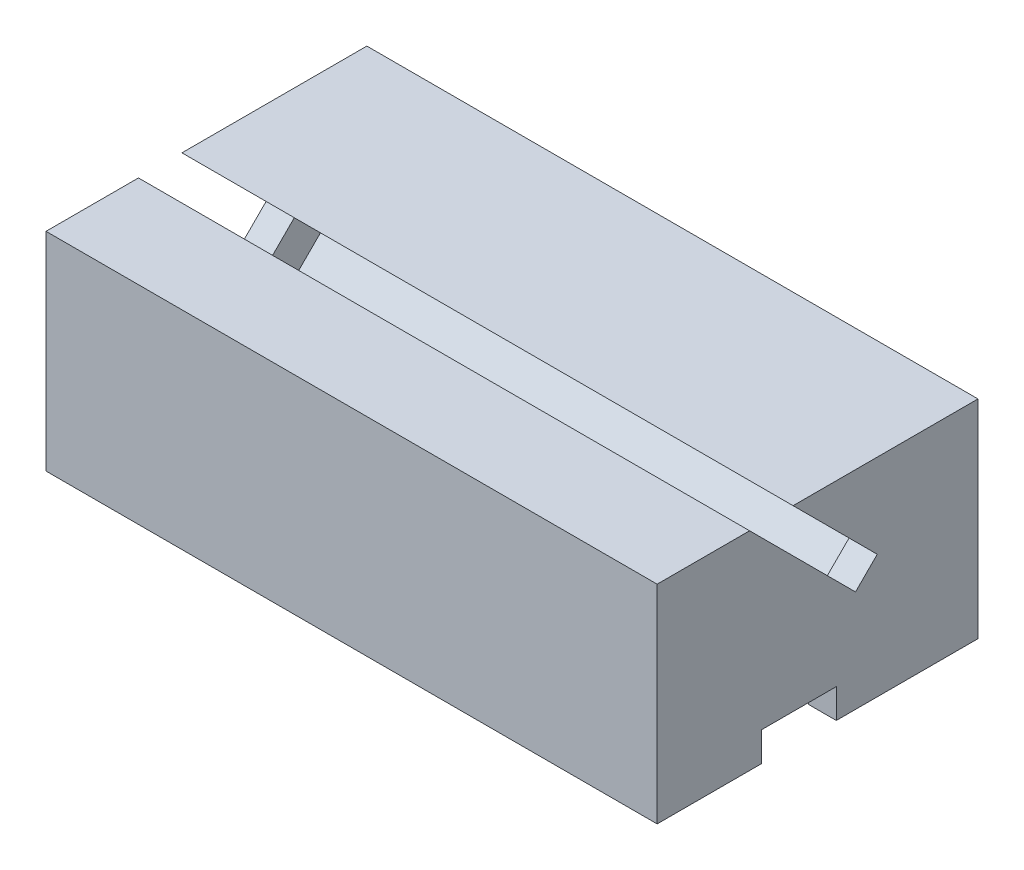
ISO-10303-21;
HEADER;
FILE_DESCRIPTION(('STEP AP214'),'2;1');
FILE_NAME('part.step','',(''),(''),'','','');
FILE_SCHEMA(('AUTOMOTIVE_DESIGN { 1 0 10303 214 1 1 1 1 }'));
ENDSEC;
DATA;
#1=APPLICATION_CONTEXT('core data for automotive mechanical design processes');
#2=APPLICATION_PROTOCOL_DEFINITION('international standard','automotive_design',2000,#1);
#3=PRODUCT_CONTEXT('',#1,'mechanical');
#4=PRODUCT('Part','Part','',(#3));
#5=PRODUCT_RELATED_PRODUCT_CATEGORY('part','',(#4));
#6=PRODUCT_DEFINITION_FORMATION('','',#4);
#7=PRODUCT_DEFINITION_CONTEXT('part definition',#1,'design');
#8=PRODUCT_DEFINITION('design','',#6,#7);
#9=PRODUCT_DEFINITION_SHAPE('','',#8);
#10=(LENGTH_UNIT() NAMED_UNIT(*) SI_UNIT(.MILLI.,.METRE.));
#11=(NAMED_UNIT(*) PLANE_ANGLE_UNIT() SI_UNIT($,.RADIAN.));
#12=(NAMED_UNIT(*) SI_UNIT($,.STERADIAN.) SOLID_ANGLE_UNIT());
#13=UNCERTAINTY_MEASURE_WITH_UNIT(LENGTH_MEASURE(1.E-05),#10,'distance_accuracy_value','');
#14=(GEOMETRIC_REPRESENTATION_CONTEXT(3) GLOBAL_UNCERTAINTY_ASSIGNED_CONTEXT((#13)) GLOBAL_UNIT_ASSIGNED_CONTEXT((#10,
#11,#12)) REPRESENTATION_CONTEXT('',''));
#15=CARTESIAN_POINT('',(0.,0.,0.));
#16=DIRECTION('',(0.,0.,1.));
#17=DIRECTION('',(1.,0.,0.));
#18=AXIS2_PLACEMENT_3D('',#15,#16,#17);
#19=CARTESIAN_POINT('',(66.1,0.,0.));
#20=DIRECTION('',(0.,-1.,0.));
#21=DIRECTION('',(0.,0.,-1.));
#22=AXIS2_PLACEMENT_3D('',#19,#20,#21);
#23=PLANE('',#22);
#24=CARTESIAN_POINT('',(12.05,0.,-14.1761300474453));
#25=DIRECTION('',(0.,-1.,0.));
#26=DIRECTION('',(0.,0.,-1.));
#27=AXIS2_PLACEMENT_3D('',#24,#25,#26);
#28=CIRCLE('',#27,2.99999999999999);
#29=CARTESIAN_POINT('',(12.05,0.,-17.1761300474453));
#30=VERTEX_POINT('',#29);
#31=EDGE_CURVE('E477',#30,#30,#28,.F.);
#32=ORIENTED_EDGE('',*,*,#31,.T.);
#33=EDGE_LOOP('',(#32));
#34=FACE_BOUND('',#33,.T.);
#35=CARTESIAN_POINT('',(54.05,0.,-14.1761300474453));
#36=DIRECTION('',(0.,-1.,0.));
#37=DIRECTION('',(0.,0.,-1.));
#38=AXIS2_PLACEMENT_3D('',#35,#36,#37);
#39=CIRCLE('',#38,3.);
#40=CARTESIAN_POINT('',(54.05,0.,-17.1761300474453));
#41=VERTEX_POINT('',#40);
#42=EDGE_CURVE('E473',#41,#41,#39,.F.);
#43=ORIENTED_EDGE('',*,*,#42,.T.);
#44=EDGE_LOOP('',(#43));
#45=FACE_BOUND('',#44,.T.);
#46=DIRECTION('',(0.,0.,-1.));
#47=VECTOR('',#46,1.);
#48=CARTESIAN_POINT('',(2.99999999999999,0.,0.));
#49=LINE('',#48,#47);
#50=CARTESIAN_POINT('',(3.,0.,-19.3761300474453));
#51=VERTEX_POINT('',#50);
#52=CARTESIAN_POINT('',(3.,0.,-24.3511300474453));
#53=VERTEX_POINT('',#52);
#54=EDGE_CURVE('E271',#51,#53,#49,.T.);
#55=ORIENTED_EDGE('',*,*,#54,.T.);
#56=DIRECTION('',(1.,0.,0.));
#57=VECTOR('',#56,1.);
#58=CARTESIAN_POINT('',(63.1,0.,-24.3511300474453));
#59=LINE('',#58,#57);
#60=CARTESIAN_POINT('',(63.1,0.,-24.3511300474453));
#61=VERTEX_POINT('',#60);
#62=EDGE_CURVE('E481',#53,#61,#59,.T.);
#63=ORIENTED_EDGE('',*,*,#62,.T.);
#64=DIRECTION('',(0.,0.,1.));
#65=VECTOR('',#64,1.);
#66=CARTESIAN_POINT('',(63.1,0.,0.));
#67=LINE('',#66,#65);
#68=CARTESIAN_POINT('',(63.1,0.,-19.3761300474453));
#69=VERTEX_POINT('',#68);
#70=EDGE_CURVE('E267',#61,#69,#67,.T.);
#71=ORIENTED_EDGE('',*,*,#70,.T.);
#72=DIRECTION('',(1.,0.,0.));
#73=VECTOR('',#72,1.);
#74=CARTESIAN_POINT('',(0.,0.,-19.3761300474453));
#75=LINE('',#74,#73);
#76=CARTESIAN_POINT('',(66.1,0.,-19.3761300474453));
#77=VERTEX_POINT('',#76);
#78=EDGE_CURVE('E222',#69,#77,#75,.T.);
#79=ORIENTED_EDGE('',*,*,#78,.T.);
#80=DIRECTION('',(0.,0.,1.));
#81=VECTOR('',#80,1.);
#82=CARTESIAN_POINT('',(66.1,0.,0.));
#83=LINE('',#82,#81);
#84=CARTESIAN_POINT('',(66.1,0.,-11.2761300474453));
#85=VERTEX_POINT('',#84);
#86=EDGE_CURVE('E425',#77,#85,#83,.T.);
#87=ORIENTED_EDGE('',*,*,#86,.T.);
#88=DIRECTION('',(1.,0.,0.));
#89=VECTOR('',#88,1.);
#90=CARTESIAN_POINT('',(0.,0.,-11.2761300474453));
#91=LINE('',#90,#89);
#92=CARTESIAN_POINT('',(63.1,0.,-11.2761300474453));
#93=VERTEX_POINT('',#92);
#94=EDGE_CURVE('E317',#93,#85,#91,.T.);
#95=ORIENTED_EDGE('',*,*,#94,.F.);
#96=DIRECTION('',(0.,0.,-1.));
#97=VECTOR('',#96,1.);
#98=CARTESIAN_POINT('',(63.1,0.,0.));
#99=LINE('',#98,#97);
#100=CARTESIAN_POINT('',(63.1,0.,-7.17613004744528));
#101=VERTEX_POINT('',#100);
#102=EDGE_CURVE('E227',#101,#93,#99,.T.);
#103=ORIENTED_EDGE('',*,*,#102,.F.);
#104=DIRECTION('',(1.,0.,0.));
#105=VECTOR('',#104,1.);
#106=CARTESIAN_POINT('',(0.,0.,-7.17613004744528));
#107=LINE('',#106,#105);
#108=CARTESIAN_POINT('',(3.,0.,-7.17613004744528));
#109=VERTEX_POINT('',#108);
#110=EDGE_CURVE('E290',#109,#101,#107,.T.);
#111=ORIENTED_EDGE('',*,*,#110,.F.);
#112=DIRECTION('',(0.,0.,1.));
#113=VECTOR('',#112,1.);
#114=CARTESIAN_POINT('',(3.,0.,0.));
#115=LINE('',#114,#113);
#116=CARTESIAN_POINT('',(3.,0.,-11.2761300474453));
#117=VERTEX_POINT('',#116);
#118=EDGE_CURVE('E325',#117,#109,#115,.T.);
#119=ORIENTED_EDGE('',*,*,#118,.F.);
#120=DIRECTION('',(1.,0.,0.));
#121=VECTOR('',#120,1.);
#122=CARTESIAN_POINT('',(0.,0.,-11.2761300474453));
#123=LINE('',#122,#121);
#124=CARTESIAN_POINT('',(0.,0.,-11.2761300474453));
#125=VERTEX_POINT('',#124);
#126=EDGE_CURVE('E321',#125,#117,#123,.T.);
#127=ORIENTED_EDGE('',*,*,#126,.F.);
#128=DIRECTION('',(0.,0.,1.));
#129=VECTOR('',#128,1.);
#130=CARTESIAN_POINT('',(0.,0.,0.));
#131=LINE('',#130,#129);
#132=CARTESIAN_POINT('',(0.,0.,-19.3761300474453));
#133=VERTEX_POINT('',#132);
#134=EDGE_CURVE('E450',#133,#125,#131,.T.);
#135=ORIENTED_EDGE('',*,*,#134,.F.);
#136=DIRECTION('',(1.,0.,0.));
#137=VECTOR('',#136,1.);
#138=CARTESIAN_POINT('',(0.,0.,-19.3761300474453));
#139=LINE('',#138,#137);
#140=EDGE_CURVE('E239',#133,#51,#139,.T.);
#141=ORIENTED_EDGE('',*,*,#140,.T.);
#142=EDGE_LOOP('',(#55,#63,#71,#79,#87,#95,#103,#111,#119,#127,#135,#141));
#143=FACE_BOUND('',#142,.T.);
#144=ADVANCED_FACE('F47',(#34,#45,#143),#23,.T.);
#145=CARTESIAN_POINT('',(66.1,16.9929085374295,-16.9929085374293));
#146=DIRECTION('',(0.,-0.707106781186552,0.707106781186543));
#147=DIRECTION('',(0.,-0.707106781186543,-0.707106781186552));
#148=AXIS2_PLACEMENT_3D('',#145,#146,#147);
#149=PLANE('',#148);
#150=DIRECTION('',(1.,0.,0.));
#151=VECTOR('',#150,1.);
#152=CARTESIAN_POINT('',(63.05,10.1795571721915,-23.8062599026674));
#153=LINE('',#152,#151);
#154=CARTESIAN_POINT('',(63.05,10.1795571721915,-23.8062599026674));
#155=VERTEX_POINT('',#154);
#156=CARTESIAN_POINT('',(66.1,10.1795571721915,-23.8062599026674));
#157=VERTEX_POINT('',#156);
#158=EDGE_CURVE('E369',#155,#157,#153,.T.);
#159=ORIENTED_EDGE('',*,*,#158,.T.);
#160=DIRECTION('',(0.,0.707106781186543,0.707106781186552));
#161=VECTOR('',#160,1.);
#162=CARTESIAN_POINT('',(66.1,16.9929085374295,-16.9929085374293));
#163=LINE('',#162,#161);
#164=CARTESIAN_POINT('',(66.1,19.2835569799682,-14.7022600948906));
#165=VERTEX_POINT('',#164);
#166=EDGE_CURVE('E410',#157,#165,#163,.T.);
#167=ORIENTED_EDGE('',*,*,#166,.T.);
#168=DIRECTION('',(-1.,0.,0.));
#169=VECTOR('',#168,1.);
#170=CARTESIAN_POINT('',(66.1,19.2835569799682,-14.7022600948906));
#171=LINE('',#170,#169);
#172=CARTESIAN_POINT('',(0.,19.2835569799682,-14.7022600948906));
#173=VERTEX_POINT('',#172);
#174=EDGE_CURVE('E469',#165,#173,#171,.T.);
#175=ORIENTED_EDGE('',*,*,#174,.T.);
#176=DIRECTION('',(0.,0.707106781186543,0.707106781186552));
#177=VECTOR('',#176,1.);
#178=CARTESIAN_POINT('',(0.,16.9929085374295,-16.9929085374293));
#179=LINE('',#178,#177);
#180=CARTESIAN_POINT('',(0.,10.1795571721915,-23.8062599026674));
#181=VERTEX_POINT('',#180);
#182=EDGE_CURVE('E435',#181,#173,#179,.T.);
#183=ORIENTED_EDGE('',*,*,#182,.F.);
#184=DIRECTION('',(-1.,0.,0.));
#185=VECTOR('',#184,1.);
#186=CARTESIAN_POINT('',(3.05,10.1795571721915,-23.8062599026674));
#187=LINE('',#186,#185);
#188=CARTESIAN_POINT('',(3.05,10.1795571721915,-23.8062599026674));
#189=VERTEX_POINT('',#188);
#190=EDGE_CURVE('E401',#189,#181,#187,.T.);
#191=ORIENTED_EDGE('',*,*,#190,.F.);
#192=DIRECTION('',(0.,0.707106781186543,0.707106781186552));
#193=VECTOR('',#192,1.);
#194=CARTESIAN_POINT('',(3.05,16.9929085374295,-16.9929085374293));
#195=LINE('',#194,#193);
#196=CARTESIAN_POINT('',(3.05,7.35113004744529,-26.6346870274136));
#197=VERTEX_POINT('',#196);
#198=EDGE_CURVE('E380',#197,#189,#195,.T.);
#199=ORIENTED_EDGE('',*,*,#198,.F.);
#200=DIRECTION('',(-1.,0.,0.));
#201=VECTOR('',#200,1.);
#202=CARTESIAN_POINT('',(66.1,7.35113004744529,-26.6346870274136));
#203=LINE('',#202,#201);
#204=CARTESIAN_POINT('',(63.05,7.35113004744529,-26.6346870274136));
#205=VERTEX_POINT('',#204);
#206=EDGE_CURVE('E466',#205,#197,#203,.T.);
#207=ORIENTED_EDGE('',*,*,#206,.F.);
#208=DIRECTION('',(0.,0.707106781186543,0.707106781186552));
#209=VECTOR('',#208,1.);
#210=CARTESIAN_POINT('',(63.05,16.9929085374295,-16.9929085374293));
#211=LINE('',#210,#209);
#212=EDGE_CURVE('E356',#205,#155,#211,.T.);
#213=ORIENTED_EDGE('',*,*,#212,.T.);
#214=EDGE_LOOP('',(#159,#167,#175,#183,#191,#199,#207,#213));
#215=FACE_BOUND('',#214,.T.);
#216=ADVANCED_FACE('F553',(#215),#149,.T.);
#217=CARTESIAN_POINT('',(66.1,14.6417784899842,-14.641778489984));
#218=DIRECTION('',(0.,0.707106781186552,-0.707106781186543));
#219=DIRECTION('',(0.,0.707106781186543,0.707106781186552));
#220=AXIS2_PLACEMENT_3D('',#217,#218,#219);
#221=PLANE('',#220);
#222=DIRECTION('',(1.,0.,0.));
#223=VECTOR('',#222,1.);
#224=CARTESIAN_POINT('',(63.05,7.82842712474617,-21.4551298552221));
#225=LINE('',#224,#223);
#226=CARTESIAN_POINT('',(63.05,7.82842712474618,-21.4551298552221));
#227=VERTEX_POINT('',#226);
#228=CARTESIAN_POINT('',(66.1,7.82842712474617,-21.4551298552221));
#229=VERTEX_POINT('',#228);
#230=EDGE_CURVE('E375',#227,#229,#225,.T.);
#231=ORIENTED_EDGE('',*,*,#230,.F.);
#232=DIRECTION('',(0.,-0.707106781186543,-0.707106781186552));
#233=VECTOR('',#232,1.);
#234=CARTESIAN_POINT('',(63.05,14.6417784899842,-14.641778489984));
#235=LINE('',#234,#233);
#236=CARTESIAN_POINT('',(63.05,5.,-24.2835569799683));
#237=VERTEX_POINT('',#236);
#238=EDGE_CURVE('E362',#227,#237,#235,.T.);
#239=ORIENTED_EDGE('',*,*,#238,.T.);
#240=DIRECTION('',(-1.,0.,0.));
#241=VECTOR('',#240,1.);
#242=CARTESIAN_POINT('',(66.1,5.,-24.2835569799683));
#243=LINE('',#242,#241);
#244=CARTESIAN_POINT('',(3.05,5.,-24.2835569799683));
#245=VERTEX_POINT('',#244);
#246=EDGE_CURVE('E463',#237,#245,#243,.T.);
#247=ORIENTED_EDGE('',*,*,#246,.T.);
#248=DIRECTION('',(0.,-0.707106781186543,-0.707106781186552));
#249=VECTOR('',#248,1.);
#250=CARTESIAN_POINT('',(3.05,14.6417784899842,-14.641778489984));
#251=LINE('',#250,#249);
#252=CARTESIAN_POINT('',(3.05,7.82842712474617,-21.4551298552221));
#253=VERTEX_POINT('',#252);
#254=EDGE_CURVE('E387',#253,#245,#251,.T.);
#255=ORIENTED_EDGE('',*,*,#254,.F.);
#256=DIRECTION('',(-1.,0.,0.));
#257=VECTOR('',#256,1.);
#258=CARTESIAN_POINT('',(3.05,7.82842712474617,-21.4551298552221));
#259=LINE('',#258,#257);
#260=CARTESIAN_POINT('',(0.,7.82842712474617,-21.4551298552221));
#261=VERTEX_POINT('',#260);
#262=EDGE_CURVE('E395',#253,#261,#259,.T.);
#263=ORIENTED_EDGE('',*,*,#262,.T.);
#264=DIRECTION('',(0.,-0.707106781186543,-0.707106781186552));
#265=VECTOR('',#264,1.);
#266=CARTESIAN_POINT('',(0.,14.6417784899842,-14.641778489984));
#267=LINE('',#266,#265);
#268=CARTESIAN_POINT('',(0.,19.2835569799682,-10.));
#269=VERTEX_POINT('',#268);
#270=EDGE_CURVE('E438',#269,#261,#267,.T.);
#271=ORIENTED_EDGE('',*,*,#270,.F.);
#272=DIRECTION('',(-1.,0.,0.));
#273=VECTOR('',#272,1.);
#274=CARTESIAN_POINT('',(66.1,19.2835569799682,-10.));
#275=LINE('',#274,#273);
#276=CARTESIAN_POINT('',(66.1,19.2835569799682,-10.));
#277=VERTEX_POINT('',#276);
#278=EDGE_CURVE('E460',#277,#269,#275,.T.);
#279=ORIENTED_EDGE('',*,*,#278,.F.);
#280=DIRECTION('',(0.,-0.707106781186543,-0.707106781186552));
#281=VECTOR('',#280,1.);
#282=CARTESIAN_POINT('',(66.1,14.6417784899842,-14.641778489984));
#283=LINE('',#282,#281);
#284=EDGE_CURVE('E414',#277,#229,#283,.T.);
#285=ORIENTED_EDGE('',*,*,#284,.T.);
#286=EDGE_LOOP('',(#231,#239,#247,#255,#263,#271,#279,#285));
#287=FACE_BOUND('',#286,.T.);
#288=ADVANCED_FACE('F559',(#287),#221,.T.);
#289=CARTESIAN_POINT('',(66.1,19.2835569799682,0.));
#290=DIRECTION('',(0.,1.,0.));
#291=DIRECTION('',(0.,0.,1.));
#292=AXIS2_PLACEMENT_3D('',#289,#290,#291);
#293=PLANE('',#292);
#294=DIRECTION('',(0.,0.,-1.));
#295=VECTOR('',#294,1.);
#296=CARTESIAN_POINT('',(0.,19.2835569799682,0.));
#297=LINE('',#296,#295);
#298=CARTESIAN_POINT('',(0.,19.2835569799682,-34.7022600948906));
#299=VERTEX_POINT('',#298);
#300=EDGE_CURVE('E405',#173,#299,#297,.T.);
#301=ORIENTED_EDGE('',*,*,#300,.F.);
#302=ORIENTED_EDGE('',*,*,#174,.F.);
#303=DIRECTION('',(0.,0.,-1.));
#304=VECTOR('',#303,1.);
#305=CARTESIAN_POINT('',(66.1,19.2835569799682,0.));
#306=LINE('',#305,#304);
#307=CARTESIAN_POINT('',(66.1,19.2835569799682,-34.7022600948906));
#308=VERTEX_POINT('',#307);
#309=EDGE_CURVE('E406',#165,#308,#306,.T.);
#310=ORIENTED_EDGE('',*,*,#309,.T.);
#311=DIRECTION('',(-1.,0.,0.));
#312=VECTOR('',#311,1.);
#313=CARTESIAN_POINT('',(66.1,19.2835569799682,-34.7022600948906));
#314=LINE('',#313,#312);
#315=EDGE_CURVE('E431',#308,#299,#314,.T.);
#316=ORIENTED_EDGE('',*,*,#315,.T.);
#317=EDGE_LOOP('',(#301,#302,#310,#316));
#318=FACE_BOUND('',#317,.T.);
#319=ADVANCED_FACE('F575',(#318),#293,.T.);
#320=CARTESIAN_POINT('',(66.1,-9.6417784899842,-9.64177848998433));
#321=DIRECTION('',(0.,0.707106781186543,0.707106781186552));
#322=DIRECTION('',(0.,-0.707106781186552,0.707106781186543));
#323=AXIS2_PLACEMENT_3D('',#320,#321,#322);
#324=PLANE('',#323);
#325=DIRECTION('',(0.,0.707106781186552,-0.707106781186543));
#326=VECTOR('',#325,1.);
#327=CARTESIAN_POINT('',(63.05,-9.6417784899842,-9.64177848998433));
#328=LINE('',#327,#326);
#329=EDGE_CURVE('E359',#237,#205,#328,.T.);
#330=ORIENTED_EDGE('',*,*,#329,.T.);
#331=ORIENTED_EDGE('',*,*,#206,.T.);
#332=DIRECTION('',(0.,0.707106781186552,-0.707106781186543));
#333=VECTOR('',#332,1.);
#334=CARTESIAN_POINT('',(3.05,-9.6417784899842,-9.64177848998433));
#335=LINE('',#334,#333);
#336=EDGE_CURVE('E391',#245,#197,#335,.T.);
#337=ORIENTED_EDGE('',*,*,#336,.F.);
#338=ORIENTED_EDGE('',*,*,#246,.F.);
#339=EDGE_LOOP('',(#330,#331,#337,#338));
#340=FACE_BOUND('',#339,.T.);
#341=ADVANCED_FACE('F571',(#340),#324,.T.);
#342=CARTESIAN_POINT('',(66.1,19.2835569799682,0.));
#343=DIRECTION('',(0.,1.,0.));
#344=DIRECTION('',(0.,0.,1.));
#345=AXIS2_PLACEMENT_3D('',#342,#343,#344);
#346=PLANE('',#345);
#347=DIRECTION('',(0.,0.,-1.));
#348=VECTOR('',#347,1.);
#349=CARTESIAN_POINT('',(0.,19.2835569799682,0.));
#350=LINE('',#349,#348);
#351=CARTESIAN_POINT('',(0.,19.2835569799682,0.));
#352=VERTEX_POINT('',#351);
#353=EDGE_CURVE('E442',#352,#269,#350,.T.);
#354=ORIENTED_EDGE('',*,*,#353,.F.);
#355=DIRECTION('',(-1.,0.,0.));
#356=VECTOR('',#355,1.);
#357=CARTESIAN_POINT('',(66.1,19.2835569799682,0.));
#358=LINE('',#357,#356);
#359=CARTESIAN_POINT('',(66.1,19.2835569799682,0.));
#360=VERTEX_POINT('',#359);
#361=EDGE_CURVE('E457',#360,#352,#358,.T.);
#362=ORIENTED_EDGE('',*,*,#361,.F.);
#363=DIRECTION('',(0.,0.,-1.));
#364=VECTOR('',#363,1.);
#365=CARTESIAN_POINT('',(66.1,19.2835569799682,0.));
#366=LINE('',#365,#364);
#367=EDGE_CURVE('E417',#360,#277,#366,.T.);
#368=ORIENTED_EDGE('',*,*,#367,.T.);
#369=ORIENTED_EDGE('',*,*,#278,.T.);
#370=EDGE_LOOP('',(#354,#362,#368,#369));
#371=FACE_BOUND('',#370,.T.);
#372=ADVANCED_FACE('F568',(#371),#346,.T.);
#373=CARTESIAN_POINT('',(66.1,0.,0.));
#374=DIRECTION('',(0.,0.,1.));
#375=DIRECTION('',(0.,-1.,0.));
#376=AXIS2_PLACEMENT_3D('',#373,#374,#375);
#377=PLANE('',#376);
#378=DIRECTION('',(0.,1.,0.));
#379=VECTOR('',#378,1.);
#380=CARTESIAN_POINT('',(0.,0.,0.));
#381=LINE('',#380,#379);
#382=CARTESIAN_POINT('',(0.,-3.175,0.));
#383=VERTEX_POINT('',#382);
#384=EDGE_CURVE('E446',#383,#352,#381,.T.);
#385=ORIENTED_EDGE('',*,*,#384,.F.);
#386=DIRECTION('',(-1.,0.,0.));
#387=VECTOR('',#386,1.);
#388=CARTESIAN_POINT('',(0.,-3.175,0.));
#389=LINE('',#388,#387);
#390=CARTESIAN_POINT('',(66.1,-3.175,0.));
#391=VERTEX_POINT('',#390);
#392=EDGE_CURVE('E297',#391,#383,#389,.T.);
#393=ORIENTED_EDGE('',*,*,#392,.F.);
#394=DIRECTION('',(0.,1.,0.));
#395=VECTOR('',#394,1.);
#396=CARTESIAN_POINT('',(66.1,0.,0.));
#397=LINE('',#396,#395);
#398=EDGE_CURVE('E421',#391,#360,#397,.T.);
#399=ORIENTED_EDGE('',*,*,#398,.T.);
#400=ORIENTED_EDGE('',*,*,#361,.T.);
#401=EDGE_LOOP('',(#385,#393,#399,#400));
#402=FACE_BOUND('',#401,.T.);
#403=ADVANCED_FACE('F520',(#402),#377,.T.);
#404=CARTESIAN_POINT('',(66.1,0.,-34.7022600948906));
#405=DIRECTION('',(0.,0.,-1.));
#406=DIRECTION('',(0.,1.,0.));
#407=AXIS2_PLACEMENT_3D('',#404,#405,#406);
#408=PLANE('',#407);
#409=DIRECTION('',(0.,-1.,0.));
#410=VECTOR('',#409,1.);
#411=CARTESIAN_POINT('',(0.,0.,-34.7022600948906));
#412=LINE('',#411,#410);
#413=CARTESIAN_POINT('',(0.,-3.175,-34.7022600948906));
#414=VERTEX_POINT('',#413);
#415=EDGE_CURVE('E411',#299,#414,#412,.T.);
#416=ORIENTED_EDGE('',*,*,#415,.F.);
#417=ORIENTED_EDGE('',*,*,#315,.F.);
#418=DIRECTION('',(0.,-1.,0.));
#419=VECTOR('',#418,1.);
#420=CARTESIAN_POINT('',(66.1,0.,-34.7022600948906));
#421=LINE('',#420,#419);
#422=CARTESIAN_POINT('',(66.1,-3.175,-34.7022600948906));
#423=VERTEX_POINT('',#422);
#424=EDGE_CURVE('E428',#308,#423,#421,.T.);
#425=ORIENTED_EDGE('',*,*,#424,.T.);
#426=DIRECTION('',(1.,0.,0.));
#427=VECTOR('',#426,1.);
#428=CARTESIAN_POINT('',(0.,-3.175,-34.7022600948906));
#429=LINE('',#428,#427);
#430=EDGE_CURVE('E259',#414,#423,#429,.T.);
#431=ORIENTED_EDGE('',*,*,#430,.F.);
#432=EDGE_LOOP('',(#416,#417,#425,#431));
#433=FACE_BOUND('',#432,.T.);
#434=ADVANCED_FACE('F502',(#433),#408,.T.);
#435=CARTESIAN_POINT('',(66.1,0.,0.));
#436=DIRECTION('',(1.,0.,0.));
#437=DIRECTION('',(0.,0.,-1.));
#438=AXIS2_PLACEMENT_3D('',#435,#436,#437);
#439=PLANE('',#438);
#440=ORIENTED_EDGE('',*,*,#166,.F.);
#441=DIRECTION('',(0.,-0.707106781186552,0.707106781186543));
#442=VECTOR('',#441,1.);
#443=CARTESIAN_POINT('',(66.1,-6.81335136523803,-6.81335136523813));
#444=LINE('',#443,#442);
#445=EDGE_CURVE('E355',#157,#229,#444,.T.);
#446=ORIENTED_EDGE('',*,*,#445,.T.);
#447=ORIENTED_EDGE('',*,*,#284,.F.);
#448=ORIENTED_EDGE('',*,*,#367,.F.);
#449=ORIENTED_EDGE('',*,*,#398,.F.);
#450=DIRECTION('',(0.,0.,1.));
#451=VECTOR('',#450,1.);
#452=CARTESIAN_POINT('',(66.1,-3.175,0.));
#453=LINE('',#452,#451);
#454=CARTESIAN_POINT('',(66.1,-3.175,-11.2761300474453));
#455=VERTEX_POINT('',#454);
#456=EDGE_CURVE('E293',#455,#391,#453,.T.);
#457=ORIENTED_EDGE('',*,*,#456,.F.);
#458=DIRECTION('',(0.,1.,0.));
#459=VECTOR('',#458,1.);
#460=CARTESIAN_POINT('',(66.1,-3.175,-11.2761300474453));
#461=LINE('',#460,#459);
#462=EDGE_CURVE('E347',#455,#85,#461,.T.);
#463=ORIENTED_EDGE('',*,*,#462,.T.);
#464=ORIENTED_EDGE('',*,*,#86,.F.);
#465=DIRECTION('',(0.,1.,0.));
#466=VECTOR('',#465,1.);
#467=CARTESIAN_POINT('',(66.1,-3.175,-19.3761300474453));
#468=LINE('',#467,#466);
#469=CARTESIAN_POINT('',(66.1,-3.175,-19.3761300474453));
#470=VERTEX_POINT('',#469);
#471=EDGE_CURVE('E264',#470,#77,#468,.T.);
#472=ORIENTED_EDGE('',*,*,#471,.F.);
#473=DIRECTION('',(0.,0.,1.));
#474=VECTOR('',#473,1.);
#475=CARTESIAN_POINT('',(66.1,-3.175,0.));
#476=LINE('',#475,#474);
#477=EDGE_CURVE('E236',#423,#470,#476,.T.);
#478=ORIENTED_EDGE('',*,*,#477,.F.);
#479=ORIENTED_EDGE('',*,*,#424,.F.);
#480=ORIENTED_EDGE('',*,*,#309,.F.);
#481=EDGE_LOOP('',(#440,#446,#447,#448,#449,#457,#463,#464,#472,#478,#479,#480));
#482=FACE_BOUND('',#481,.T.);
#483=ADVANCED_FACE('F507',(#482),#439,.T.);
#484=CARTESIAN_POINT('',(0.,0.,0.));
#485=DIRECTION('',(1.,0.,0.));
#486=DIRECTION('',(0.,0.,-1.));
#487=AXIS2_PLACEMENT_3D('',#484,#485,#486);
#488=PLANE('',#487);
#489=DIRECTION('',(0.,-0.707106781186552,0.707106781186543));
#490=VECTOR('',#489,1.);
#491=CARTESIAN_POINT('',(0.,-6.81335136523803,-6.81335136523813));
#492=LINE('',#491,#490);
#493=EDGE_CURVE('E379',#181,#261,#492,.T.);
#494=ORIENTED_EDGE('',*,*,#493,.F.);
#495=ORIENTED_EDGE('',*,*,#182,.T.);
#496=ORIENTED_EDGE('',*,*,#300,.T.);
#497=ORIENTED_EDGE('',*,*,#415,.T.);
#498=DIRECTION('',(0.,0.,-1.));
#499=VECTOR('',#498,1.);
#500=CARTESIAN_POINT('',(0.,-3.175,0.));
#501=LINE('',#500,#499);
#502=CARTESIAN_POINT('',(0.,-3.175,-19.3761300474453));
#503=VERTEX_POINT('',#502);
#504=EDGE_CURVE('E255',#503,#414,#501,.T.);
#505=ORIENTED_EDGE('',*,*,#504,.F.);
#506=DIRECTION('',(0.,1.,0.));
#507=VECTOR('',#506,1.);
#508=CARTESIAN_POINT('',(0.,-3.175,-19.3761300474453));
#509=LINE('',#508,#507);
#510=EDGE_CURVE('E279',#503,#133,#509,.T.);
#511=ORIENTED_EDGE('',*,*,#510,.T.);
#512=ORIENTED_EDGE('',*,*,#134,.T.);
#513=DIRECTION('',(0.,1.,0.));
#514=VECTOR('',#513,1.);
#515=CARTESIAN_POINT('',(0.,-3.175,-11.2761300474453));
#516=LINE('',#515,#514);
#517=CARTESIAN_POINT('',(0.,-3.175,-11.2761300474453));
#518=VERTEX_POINT('',#517);
#519=EDGE_CURVE('E343',#518,#125,#516,.T.);
#520=ORIENTED_EDGE('',*,*,#519,.F.);
#521=DIRECTION('',(0.,0.,-1.));
#522=VECTOR('',#521,1.);
#523=CARTESIAN_POINT('',(0.,-3.175,0.));
#524=LINE('',#523,#522);
#525=EDGE_CURVE('E301',#383,#518,#524,.T.);
#526=ORIENTED_EDGE('',*,*,#525,.F.);
#527=ORIENTED_EDGE('',*,*,#384,.T.);
#528=ORIENTED_EDGE('',*,*,#353,.T.);
#529=ORIENTED_EDGE('',*,*,#270,.T.);
#530=EDGE_LOOP('',(#494,#495,#496,#497,#505,#511,#512,#520,#526,#527,#528,#529));
#531=FACE_BOUND('',#530,.T.);
#532=ADVANCED_FACE('F522',(#531),#488,.F.);
#533=CARTESIAN_POINT('',(3.05,-6.81335136523803,-6.81335136523813));
#534=DIRECTION('',(0.,-0.707106781186543,-0.707106781186552));
#535=DIRECTION('',(0.,0.707106781186552,-0.707106781186543));
#536=AXIS2_PLACEMENT_3D('',#533,#534,#535);
#537=PLANE('',#536);
#538=ORIENTED_EDGE('',*,*,#493,.T.);
#539=ORIENTED_EDGE('',*,*,#262,.F.);
#540=DIRECTION('',(0.,-0.707106781186552,0.707106781186543));
#541=VECTOR('',#540,1.);
#542=CARTESIAN_POINT('',(3.05,-6.81335136523803,-6.81335136523813));
#543=LINE('',#542,#541);
#544=EDGE_CURVE('E384',#189,#253,#543,.T.);
#545=ORIENTED_EDGE('',*,*,#544,.F.);
#546=ORIENTED_EDGE('',*,*,#190,.T.);
#547=EDGE_LOOP('',(#538,#539,#545,#546));
#548=FACE_BOUND('',#547,.T.);
#549=ADVANCED_FACE('F760',(#548),#537,.F.);
#550=CARTESIAN_POINT('',(3.05,0.,0.));
#551=DIRECTION('',(1.,0.,0.));
#552=DIRECTION('',(0.,0.,-1.));
#553=AXIS2_PLACEMENT_3D('',#550,#551,#552);
#554=PLANE('',#553);
#555=ORIENTED_EDGE('',*,*,#198,.T.);
#556=ORIENTED_EDGE('',*,*,#544,.T.);
#557=ORIENTED_EDGE('',*,*,#254,.T.);
#558=ORIENTED_EDGE('',*,*,#336,.T.);
#559=EDGE_LOOP('',(#555,#556,#557,#558));
#560=FACE_BOUND('',#559,.T.);
#561=ADVANCED_FACE('F803',(#560),#554,.T.);
#562=CARTESIAN_POINT('',(63.05,-6.81335136523803,-6.81335136523813));
#563=DIRECTION('',(0.,0.707106781186543,0.707106781186552));
#564=DIRECTION('',(0.,-0.707106781186552,0.707106781186543));
#565=AXIS2_PLACEMENT_3D('',#562,#563,#564);
#566=PLANE('',#565);
#567=ORIENTED_EDGE('',*,*,#445,.F.);
#568=ORIENTED_EDGE('',*,*,#158,.F.);
#569=DIRECTION('',(0.,-0.707106781186552,0.707106781186543));
#570=VECTOR('',#569,1.);
#571=CARTESIAN_POINT('',(63.05,-6.81335136523803,-6.81335136523813));
#572=LINE('',#571,#570);
#573=EDGE_CURVE('E365',#155,#227,#572,.T.);
#574=ORIENTED_EDGE('',*,*,#573,.T.);
#575=ORIENTED_EDGE('',*,*,#230,.T.);
#576=EDGE_LOOP('',(#567,#568,#574,#575));
#577=FACE_BOUND('',#576,.T.);
#578=ADVANCED_FACE('F549',(#577),#566,.T.);
#579=CARTESIAN_POINT('',(63.05,0.,0.));
#580=DIRECTION('',(-1.,0.,0.));
#581=DIRECTION('',(0.,0.,-1.));
#582=AXIS2_PLACEMENT_3D('',#579,#580,#581);
#583=PLANE('',#582);
#584=ORIENTED_EDGE('',*,*,#212,.F.);
#585=ORIENTED_EDGE('',*,*,#329,.F.);
#586=ORIENTED_EDGE('',*,*,#238,.F.);
#587=ORIENTED_EDGE('',*,*,#573,.F.);
#588=EDGE_LOOP('',(#584,#585,#586,#587));
#589=FACE_BOUND('',#588,.T.);
#590=ADVANCED_FACE('F542',(#589),#583,.T.);
#591=CARTESIAN_POINT('',(63.1,-3.175,0.));
#592=DIRECTION('',(1.,0.,0.));
#593=DIRECTION('',(0.,0.,-1.));
#594=AXIS2_PLACEMENT_3D('',#591,#592,#593);
#595=PLANE('',#594);
#596=ORIENTED_EDGE('',*,*,#102,.T.);
#597=DIRECTION('',(0.,1.,0.));
#598=VECTOR('',#597,1.);
#599=CARTESIAN_POINT('',(63.1,-3.175,-11.2761300474453));
#600=LINE('',#599,#598);
#601=CARTESIAN_POINT('',(63.1,-3.175,-11.2761300474453));
#602=VERTEX_POINT('',#601);
#603=EDGE_CURVE('E351',#602,#93,#600,.T.);
#604=ORIENTED_EDGE('',*,*,#603,.F.);
#605=DIRECTION('',(0.,0.,-1.));
#606=VECTOR('',#605,1.);
#607=CARTESIAN_POINT('',(63.1,-3.175,0.));
#608=LINE('',#607,#606);
#609=CARTESIAN_POINT('',(63.1,-3.175,-7.17613004744528));
#610=VERTEX_POINT('',#609);
#611=EDGE_CURVE('E285',#610,#602,#608,.T.);
#612=ORIENTED_EDGE('',*,*,#611,.F.);
#613=DIRECTION('',(0.,1.,0.));
#614=VECTOR('',#613,1.);
#615=CARTESIAN_POINT('',(63.1,-3.175,-7.17613004744528));
#616=LINE('',#615,#614);
#617=EDGE_CURVE('E313',#610,#101,#616,.T.);
#618=ORIENTED_EDGE('',*,*,#617,.T.);
#619=EDGE_LOOP('',(#596,#604,#612,#618));
#620=FACE_BOUND('',#619,.T.);
#621=ADVANCED_FACE('F539',(#620),#595,.F.);
#622=CARTESIAN_POINT('',(0.,-3.175,-11.2761300474453));
#623=DIRECTION('',(0.,0.,1.));
#624=DIRECTION('',(0.,-1.,0.));
#625=AXIS2_PLACEMENT_3D('',#622,#623,#624);
#626=PLANE('',#625);
#627=ORIENTED_EDGE('',*,*,#94,.T.);
#628=ORIENTED_EDGE('',*,*,#462,.F.);
#629=DIRECTION('',(1.,0.,0.));
#630=VECTOR('',#629,1.);
#631=CARTESIAN_POINT('',(0.,-3.175,-11.2761300474453));
#632=LINE('',#631,#630);
#633=EDGE_CURVE('E289',#602,#455,#632,.T.);
#634=ORIENTED_EDGE('',*,*,#633,.F.);
#635=ORIENTED_EDGE('',*,*,#603,.T.);
#636=EDGE_LOOP('',(#627,#628,#634,#635));
#637=FACE_BOUND('',#636,.T.);
#638=ADVANCED_FACE('F511',(#637),#626,.F.);
#639=CARTESIAN_POINT('',(0.,-3.175,-11.2761300474453));
#640=DIRECTION('',(0.,0.,1.));
#641=DIRECTION('',(0.,-1.,0.));
#642=AXIS2_PLACEMENT_3D('',#639,#640,#641);
#643=PLANE('',#642);
#644=ORIENTED_EDGE('',*,*,#126,.T.);
#645=DIRECTION('',(0.,1.,0.));
#646=VECTOR('',#645,1.);
#647=CARTESIAN_POINT('',(3.,-3.175,-11.2761300474453));
#648=LINE('',#647,#646);
#649=CARTESIAN_POINT('',(3.,-3.175,-11.2761300474453));
#650=VERTEX_POINT('',#649);
#651=EDGE_CURVE('E339',#650,#117,#648,.T.);
#652=ORIENTED_EDGE('',*,*,#651,.F.);
#653=DIRECTION('',(1.,0.,0.));
#654=VECTOR('',#653,1.);
#655=CARTESIAN_POINT('',(0.,-3.175,-11.2761300474453));
#656=LINE('',#655,#654);
#657=EDGE_CURVE('E304',#518,#650,#656,.T.);
#658=ORIENTED_EDGE('',*,*,#657,.F.);
#659=ORIENTED_EDGE('',*,*,#519,.T.);
#660=EDGE_LOOP('',(#644,#652,#658,#659));
#661=FACE_BOUND('',#660,.T.);
#662=ADVANCED_FACE('F529',(#661),#643,.F.);
#663=CARTESIAN_POINT('',(3.,-3.175,0.));
#664=DIRECTION('',(-1.,0.,0.));
#665=DIRECTION('',(0.,0.,1.));
#666=AXIS2_PLACEMENT_3D('',#663,#664,#665);
#667=PLANE('',#666);
#668=ORIENTED_EDGE('',*,*,#118,.T.);
#669=DIRECTION('',(0.,1.,0.));
#670=VECTOR('',#669,1.);
#671=CARTESIAN_POINT('',(3.,-3.175,-7.17613004744528));
#672=LINE('',#671,#670);
#673=CARTESIAN_POINT('',(3.,-3.175,-7.17613004744528));
#674=VERTEX_POINT('',#673);
#675=EDGE_CURVE('E335',#674,#109,#672,.T.);
#676=ORIENTED_EDGE('',*,*,#675,.F.);
#677=DIRECTION('',(0.,0.,1.));
#678=VECTOR('',#677,1.);
#679=CARTESIAN_POINT('',(3.,-3.175,0.));
#680=LINE('',#679,#678);
#681=EDGE_CURVE('E307',#650,#674,#680,.T.);
#682=ORIENTED_EDGE('',*,*,#681,.F.);
#683=ORIENTED_EDGE('',*,*,#651,.T.);
#684=EDGE_LOOP('',(#668,#676,#682,#683));
#685=FACE_BOUND('',#684,.T.);
#686=ADVANCED_FACE('F532',(#685),#667,.F.);
#687=CARTESIAN_POINT('',(0.,-3.175,-7.17613004744528));
#688=DIRECTION('',(0.,0.,1.));
#689=DIRECTION('',(0.,-1.,0.));
#690=AXIS2_PLACEMENT_3D('',#687,#688,#689);
#691=PLANE('',#690);
#692=ORIENTED_EDGE('',*,*,#110,.T.);
#693=ORIENTED_EDGE('',*,*,#617,.F.);
#694=DIRECTION('',(1.,0.,0.));
#695=VECTOR('',#694,1.);
#696=CARTESIAN_POINT('',(0.,-3.175,-7.17613004744528));
#697=LINE('',#696,#695);
#698=EDGE_CURVE('E310',#674,#610,#697,.T.);
#699=ORIENTED_EDGE('',*,*,#698,.F.);
#700=ORIENTED_EDGE('',*,*,#675,.T.);
#701=EDGE_LOOP('',(#692,#693,#699,#700));
#702=FACE_BOUND('',#701,.T.);
#703=ADVANCED_FACE('F536',(#702),#691,.F.);
#704=CARTESIAN_POINT('',(0.,-3.175,0.));
#705=DIRECTION('',(0.,-1.,0.));
#706=DIRECTION('',(0.,0.,-1.));
#707=AXIS2_PLACEMENT_3D('',#704,#705,#706);
#708=PLANE('',#707);
#709=ORIENTED_EDGE('',*,*,#611,.T.);
#710=ORIENTED_EDGE('',*,*,#633,.T.);
#711=ORIENTED_EDGE('',*,*,#456,.T.);
#712=ORIENTED_EDGE('',*,*,#392,.T.);
#713=ORIENTED_EDGE('',*,*,#525,.T.);
#714=ORIENTED_EDGE('',*,*,#657,.T.);
#715=ORIENTED_EDGE('',*,*,#681,.T.);
#716=ORIENTED_EDGE('',*,*,#698,.T.);
#717=EDGE_LOOP('',(#709,#710,#711,#712,#713,#714,#715,#716));
#718=FACE_BOUND('',#717,.T.);
#719=ADVANCED_FACE('F517',(#718),#708,.T.);
#720=CARTESIAN_POINT('',(0.,-3.175,-19.3761300474453));
#721=DIRECTION('',(0.,0.,1.));
#722=DIRECTION('',(0.,-1.,0.));
#723=AXIS2_PLACEMENT_3D('',#720,#721,#722);
#724=PLANE('',#723);
#725=ORIENTED_EDGE('',*,*,#78,.F.);
#726=DIRECTION('',(0.,1.,0.));
#727=VECTOR('',#726,1.);
#728=CARTESIAN_POINT('',(63.1,-3.175,-19.3761300474453));
#729=LINE('',#728,#727);
#730=CARTESIAN_POINT('',(63.1,-3.175,-19.3761300474453));
#731=VERTEX_POINT('',#730);
#732=EDGE_CURVE('E217',#731,#69,#729,.T.);
#733=ORIENTED_EDGE('',*,*,#732,.F.);
#734=DIRECTION('',(1.,0.,0.));
#735=VECTOR('',#734,1.);
#736=CARTESIAN_POINT('',(0.,-3.175,-19.3761300474453));
#737=LINE('',#736,#735);
#738=EDGE_CURVE('E220',#731,#470,#737,.T.);
#739=ORIENTED_EDGE('',*,*,#738,.T.);
#740=ORIENTED_EDGE('',*,*,#471,.T.);
#741=EDGE_LOOP('',(#725,#733,#739,#740));
#742=FACE_BOUND('',#741,.T.);
#743=ADVANCED_FACE('F219',(#742),#724,.T.);
#744=CARTESIAN_POINT('',(63.1,-3.175,0.));
#745=DIRECTION('',(-1.,0.,0.));
#746=DIRECTION('',(0.,0.,1.));
#747=AXIS2_PLACEMENT_3D('',#744,#745,#746);
#748=PLANE('',#747);
#749=ORIENTED_EDGE('',*,*,#70,.F.);
#750=DIRECTION('',(0.,0.707106781186544,0.707106781186551));
#751=VECTOR('',#750,1.);
#752=CARTESIAN_POINT('',(63.1,10.5880650237226,-13.7630650237225));
#753=LINE('',#752,#751);
#754=CARTESIAN_POINT('',(63.1,-3.175,-27.5261300474453));
#755=VERTEX_POINT('',#754);
#756=EDGE_CURVE('E57',#61,#755,#753,.F.);
#757=ORIENTED_EDGE('',*,*,#756,.T.);
#758=DIRECTION('',(0.,0.,1.));
#759=VECTOR('',#758,1.);
#760=CARTESIAN_POINT('',(63.1,-3.175,0.));
#761=LINE('',#760,#759);
#762=EDGE_CURVE('E233',#755,#731,#761,.T.);
#763=ORIENTED_EDGE('',*,*,#762,.T.);
#764=ORIENTED_EDGE('',*,*,#732,.T.);
#765=EDGE_LOOP('',(#749,#757,#763,#764));
#766=FACE_BOUND('',#765,.T.);
#767=ADVANCED_FACE('F241',(#766),#748,.T.);
#768=CARTESIAN_POINT('',(2.99999999999999,-3.175,0.));
#769=DIRECTION('',(1.,0.,0.));
#770=DIRECTION('',(0.,0.,-1.));
#771=AXIS2_PLACEMENT_3D('',#768,#769,#770);
#772=PLANE('',#771);
#773=DIRECTION('',(0.,0.,-1.));
#774=VECTOR('',#773,1.);
#775=CARTESIAN_POINT('',(2.99999999999999,-3.175,0.));
#776=LINE('',#775,#774);
#777=CARTESIAN_POINT('',(3.,-3.175,-19.3761300474453));
#778=VERTEX_POINT('',#777);
#779=CARTESIAN_POINT('',(3.,-3.175,-27.5261300474453));
#780=VERTEX_POINT('',#779);
#781=EDGE_CURVE('E246',#778,#780,#776,.T.);
#782=ORIENTED_EDGE('',*,*,#781,.T.);
#783=DIRECTION('',(0.,-0.707106781186544,-0.707106781186551));
#784=VECTOR('',#783,1.);
#785=CARTESIAN_POINT('',(3.,10.5880650237226,-13.7630650237225));
#786=LINE('',#785,#784);
#787=EDGE_CURVE('E11',#780,#53,#786,.F.);
#788=ORIENTED_EDGE('',*,*,#787,.T.);
#789=ORIENTED_EDGE('',*,*,#54,.F.);
#790=DIRECTION('',(0.,1.,0.));
#791=VECTOR('',#790,1.);
#792=CARTESIAN_POINT('',(3.,-3.175,-19.3761300474453));
#793=LINE('',#792,#791);
#794=EDGE_CURVE('E228',#778,#51,#793,.T.);
#795=ORIENTED_EDGE('',*,*,#794,.F.);
#796=EDGE_LOOP('',(#782,#788,#789,#795));
#797=FACE_BOUND('',#796,.T.);
#798=ADVANCED_FACE('F494',(#797),#772,.T.);
#799=CARTESIAN_POINT('',(0.,-3.175,-19.3761300474453));
#800=DIRECTION('',(0.,0.,1.));
#801=DIRECTION('',(0.,-1.,0.));
#802=AXIS2_PLACEMENT_3D('',#799,#800,#801);
#803=PLANE('',#802);
#804=ORIENTED_EDGE('',*,*,#140,.F.);
#805=ORIENTED_EDGE('',*,*,#510,.F.);
#806=DIRECTION('',(1.,0.,0.));
#807=VECTOR('',#806,1.);
#808=CARTESIAN_POINT('',(0.,-3.175,-19.3761300474453));
#809=LINE('',#808,#807);
#810=EDGE_CURVE('E251',#503,#778,#809,.T.);
#811=ORIENTED_EDGE('',*,*,#810,.T.);
#812=ORIENTED_EDGE('',*,*,#794,.T.);
#813=EDGE_LOOP('',(#804,#805,#811,#812));
#814=FACE_BOUND('',#813,.T.);
#815=ADVANCED_FACE('F496',(#814),#803,.T.);
#816=CARTESIAN_POINT('',(0.,-3.175,0.));
#817=DIRECTION('',(0.,-1.,0.));
#818=DIRECTION('',(0.,0.,-1.));
#819=AXIS2_PLACEMENT_3D('',#816,#817,#818);
#820=PLANE('',#819);
#821=ORIENTED_EDGE('',*,*,#738,.F.);
#822=ORIENTED_EDGE('',*,*,#762,.F.);
#823=DIRECTION('',(1.,0.,0.));
#824=VECTOR('',#823,1.);
#825=CARTESIAN_POINT('',(0.,-3.175,-27.5261300474453));
#826=LINE('',#825,#824);
#827=EDGE_CURVE('E243',#780,#755,#826,.T.);
#828=ORIENTED_EDGE('',*,*,#827,.F.);
#829=ORIENTED_EDGE('',*,*,#781,.F.);
#830=ORIENTED_EDGE('',*,*,#810,.F.);
#831=ORIENTED_EDGE('',*,*,#504,.T.);
#832=ORIENTED_EDGE('',*,*,#430,.T.);
#833=ORIENTED_EDGE('',*,*,#477,.T.);
#834=EDGE_LOOP('',(#821,#822,#828,#829,#830,#831,#832,#833));
#835=FACE_BOUND('',#834,.T.);
#836=ADVANCED_FACE('F232',(#835),#820,.T.);
#837=CARTESIAN_POINT('',(12.05,0.,-14.1761300474453));
#838=DIRECTION('',(0.,-1.,0.));
#839=DIRECTION('',(0.,0.,-1.));
#840=AXIS2_PLACEMENT_3D('',#837,#838,#839);
#841=CONICAL_SURFACE('',#840,2.99999999999999,0.785398163397443);
#842=CARTESIAN_POINT('',(12.05,1.50000000000001,-14.1761300474453));
#843=DIRECTION('',(0.,-1.,0.));
#844=DIRECTION('',(0.,0.,-1.));
#845=AXIS2_PLACEMENT_3D('',#842,#843,#844);
#846=CIRCLE('',#845,1.5);
#847=CARTESIAN_POINT('',(12.05,1.50000000000001,-15.6761300474453));
#848=VERTEX_POINT('',#847);
#849=EDGE_CURVE('E268',#848,#848,#846,.T.);
#850=CARTESIAN_POINT('',(12.05,0.,-17.1761300474453));
#851=CARTESIAN_POINT('',(12.05,0.015625000000001,-17.1605050474453));
#852=CARTESIAN_POINT('',(12.05,0.0312500000000008,-17.1448800474453));
#853=CARTESIAN_POINT('',(12.05,0.0625000000000003,-17.1136300474453));
#854=CARTESIAN_POINT('',(12.05,0.078125,-17.0980050474453));
#855=CARTESIAN_POINT('',(12.05,0.109375,-17.0667550474453));
#856=CARTESIAN_POINT('',(12.05,0.125000000000001,-17.0511300474453));
#857=CARTESIAN_POINT('',(12.05,0.156250000000001,-17.0198800474453));
#858=CARTESIAN_POINT('',(12.05,0.171875000000001,-17.0042550474453));
#859=CARTESIAN_POINT('',(12.05,0.203125000000001,-16.9730050474453));
#860=CARTESIAN_POINT('',(12.05,0.218750000000001,-16.9573800474453));
#861=CARTESIAN_POINT('',(12.05,0.250000000000002,-16.9261300474453));
#862=CARTESIAN_POINT('',(12.05,0.265625000000001,-16.9105050474453));
#863=CARTESIAN_POINT('',(12.05,0.296875000000001,-16.8792550474453));
#864=CARTESIAN_POINT('',(12.05,0.312500000000001,-16.8636300474453));
#865=CARTESIAN_POINT('',(12.05,0.343750000000002,-16.8323800474453));
#866=CARTESIAN_POINT('',(12.05,0.359375000000002,-16.8167550474453));
#867=CARTESIAN_POINT('',(12.05,0.390625000000002,-16.7855050474453));
#868=CARTESIAN_POINT('',(12.05,0.406250000000002,-16.7698800474453));
#869=CARTESIAN_POINT('',(12.05,0.437500000000002,-16.7386300474453));
#870=CARTESIAN_POINT('',(12.05,0.453125000000003,-16.7230050474453));
#871=CARTESIAN_POINT('',(12.05,0.484375000000003,-16.6917550474453));
#872=CARTESIAN_POINT('',(12.05,0.500000000000002,-16.6761300474453));
#873=CARTESIAN_POINT('',(12.05,0.531250000000003,-16.6448800474453));
#874=CARTESIAN_POINT('',(12.05,0.546875000000003,-16.6292550474453));
#875=CARTESIAN_POINT('',(12.05,0.578125000000003,-16.5980050474453));
#876=CARTESIAN_POINT('',(12.05,0.593750000000003,-16.5823800474453));
#877=CARTESIAN_POINT('',(12.05,0.625000000000003,-16.5511300474453));
#878=CARTESIAN_POINT('',(12.05,0.640625000000003,-16.5355050474453));
#879=CARTESIAN_POINT('',(12.05,0.671875000000004,-16.5042550474453));
#880=CARTESIAN_POINT('',(12.05,0.687500000000004,-16.4886300474453));
#881=CARTESIAN_POINT('',(12.05,0.718750000000004,-16.4573800474453));
#882=CARTESIAN_POINT('',(12.05,0.734375000000004,-16.4417550474453));
#883=CARTESIAN_POINT('',(12.05,0.765625000000004,-16.4105050474453));
#884=CARTESIAN_POINT('',(12.05,0.781250000000004,-16.3948800474453));
#885=CARTESIAN_POINT('',(12.05,0.812500000000005,-16.3636300474453));
#886=CARTESIAN_POINT('',(12.05,0.828125000000005,-16.3480050474453));
#887=CARTESIAN_POINT('',(12.05,0.859375000000005,-16.3167550474453));
#888=CARTESIAN_POINT('',(12.05,0.875000000000004,-16.3011300474453));
#889=CARTESIAN_POINT('',(12.05,0.906250000000005,-16.2698800474453));
#890=CARTESIAN_POINT('',(12.05,0.921875000000005,-16.2542550474453));
#891=CARTESIAN_POINT('',(12.05,0.953125000000005,-16.2230050474453));
#892=CARTESIAN_POINT('',(12.05,0.968750000000005,-16.2073800474453));
#893=CARTESIAN_POINT('',(12.05,1.00000000000001,-16.1761300474453));
#894=CARTESIAN_POINT('',(12.05,1.01562500000001,-16.1605050474453));
#895=CARTESIAN_POINT('',(12.05,1.04687500000001,-16.1292550474453));
#896=CARTESIAN_POINT('',(12.05,1.06250000000001,-16.1136300474453));
#897=CARTESIAN_POINT('',(12.05,1.09375000000001,-16.0823800474453));
#898=CARTESIAN_POINT('',(12.05,1.10937500000001,-16.0667550474453));
#899=CARTESIAN_POINT('',(12.05,1.14062500000001,-16.0355050474453));
#900=CARTESIAN_POINT('',(12.05,1.15625000000001,-16.0198800474453));
#901=CARTESIAN_POINT('',(12.05,1.18750000000001,-15.9886300474453));
#902=CARTESIAN_POINT('',(12.05,1.20312500000001,-15.9730050474453));
#903=CARTESIAN_POINT('',(12.05,1.23437500000001,-15.9417550474453));
#904=CARTESIAN_POINT('',(12.05,1.25000000000001,-15.9261300474453));
#905=CARTESIAN_POINT('',(12.05,1.28125000000001,-15.8948800474453));
#906=CARTESIAN_POINT('',(12.05,1.29687500000001,-15.8792550474453));
#907=CARTESIAN_POINT('',(12.05,1.32812500000001,-15.8480050474453));
#908=CARTESIAN_POINT('',(12.05,1.34375000000001,-15.8323800474453));
#909=CARTESIAN_POINT('',(12.05,1.37500000000001,-15.8011300474453));
#910=CARTESIAN_POINT('',(12.05,1.39062500000001,-15.7855050474453));
#911=CARTESIAN_POINT('',(12.05,1.42187500000001,-15.7542550474453));
#912=CARTESIAN_POINT('',(12.05,1.43750000000001,-15.7386300474453));
#913=CARTESIAN_POINT('',(12.05,1.46875000000001,-15.7073800474453));
#914=CARTESIAN_POINT('',(12.05,1.48437500000001,-15.6917550474453));
#915=CARTESIAN_POINT('',(12.05,1.50000000000001,-15.6761300474453));
#916=B_SPLINE_CURVE_WITH_KNOTS('',3,(#850,#851,#852,#853,#854,#855,#856,#857,#858,#859,#860,
#861,#862,#863,#864,#865,#866,#867,#868,#869,#870,#871,#872,#873,#874,#875,#876,#877,#878,#879,
#880,#881,#882,#883,#884,#885,#886,#887,#888,#889,#890,#891,#892,#893,#894,#895,#896,#897,#898,
#899,#900,#901,#902,#903,#904,#905,#906,#907,#908,#909,#910,#911,#912,#913,#914,#915),
.UNSPECIFIED.,.F.,.F.,(4,2,2,2,2,2,2,2,2,2,2,2,2,2,2,2,2,2,2,2,2,2,2,2,2,2,2,2,2,2,2,2,4),(0.,
0.0662912607362378,0.132582521472478,0.198873782208716,0.265165042944956,0.331456303681194,
0.397747564417434,0.464038825153672,0.53033008588991,0.59662134662615,0.662912607362388,
0.729203868098628,0.795495128834866,0.861786389571106,0.928077650307344,0.994368911043582,
1.06066017177982,1.12695143251606,1.1932426932523,1.25953395398854,1.32582521472478,
1.39211647546102,1.45840773619725,1.52469899693349,1.59099025766973,1.65728151840597,
1.72357277914221,1.78986403987845,1.85615530061469,1.92244656135093,1.98873782208717,
2.0550290828234,2.12132034355964),.UNSPECIFIED.);
#917=EDGE_CURVE('BSEAM592',#30,#848,#916,.T.);
#918=ORIENTED_EDGE('',*,*,#31,.F.);
#919=ORIENTED_EDGE('',*,*,#849,.F.);
#920=ORIENTED_EDGE('',*,*,#917,.T.);
#921=ORIENTED_EDGE('',*,*,#917,.F.);
#922=EDGE_LOOP('',(#918,#920,#919,#921));
#923=FACE_BOUND('',#922,.T.);
#924=ADVANCED_FACE('F592',(#923),#841,.F.);
#925=CARTESIAN_POINT('',(12.05,1.50000000000001,-14.1761300474453));
#926=DIRECTION('',(0.,-1.,0.));
#927=DIRECTION('',(0.,0.,-1.));
#928=AXIS2_PLACEMENT_3D('',#925,#926,#927);
#929=CONICAL_SURFACE('',#928,1.49999999999998,0.785398163397443);
#930=CARTESIAN_POINT('',(12.05,3.,-14.1761300474453));
#931=VERTEX_POINT('',#930);
#932=VERTEX_LOOP('',#931);
#933=FACE_BOUND('',#932,.T.);
#934=ORIENTED_EDGE('',*,*,#849,.T.);
#935=EDGE_LOOP('',(#934));
#936=FACE_BOUND('',#935,.T.);
#937=ADVANCED_FACE('F584',(#933,#936),#929,.F.);
#938=CARTESIAN_POINT('',(54.05,1.49999999999999,-14.1761300474453));
#939=DIRECTION('',(0.,-1.,0.));
#940=DIRECTION('',(0.,0.,-1.));
#941=AXIS2_PLACEMENT_3D('',#938,#939,#940);
#942=CONICAL_SURFACE('',#941,1.5,0.785398163397451);
#943=ORIENTED_EDGE('',*,*,#42,.F.);
#944=EDGE_LOOP('',(#943));
#945=FACE_BOUND('',#944,.T.);
#946=CARTESIAN_POINT('',(54.05,1.49999999999999,-14.1761300474453));
#947=DIRECTION('',(0.,-1.,0.));
#948=DIRECTION('',(0.,0.,-1.));
#949=AXIS2_PLACEMENT_3D('',#946,#947,#948);
#950=CIRCLE('',#949,1.5);
#951=CARTESIAN_POINT('',(54.05,1.49999999999999,-15.6761300474453));
#952=VERTEX_POINT('',#951);
#953=EDGE_CURVE('E485',#952,#952,#950,.T.);
#954=ORIENTED_EDGE('',*,*,#953,.F.);
#955=EDGE_LOOP('',(#954));
#956=FACE_BOUND('',#955,.T.);
#957=ADVANCED_FACE('F591',(#945,#956),#942,.F.);
#958=CARTESIAN_POINT('',(54.05,1.50000000000002,-14.1761300474453));
#959=DIRECTION('',(0.,-1.,0.));
#960=DIRECTION('',(0.,0.,-1.));
#961=AXIS2_PLACEMENT_3D('',#958,#959,#960);
#962=CONICAL_SURFACE('',#961,1.49999999999999,0.785398163397451);
#963=ORIENTED_EDGE('',*,*,#953,.T.);
#964=EDGE_LOOP('',(#963));
#965=FACE_BOUND('',#964,.T.);
#966=CARTESIAN_POINT('',(54.05,3.,-14.1761300474453));
#967=VERTEX_POINT('',#966);
#968=VERTEX_LOOP('',#967);
#969=FACE_BOUND('',#968,.T.);
#970=ADVANCED_FACE('F600',(#965,#969),#962,.F.);
#971=CARTESIAN_POINT('',(66.1,0.,-24.3511300474453));
#972=DIRECTION('',(0.,-0.707106781186551,0.707106781186544));
#973=DIRECTION('',(-1.,0.,0.));
#974=AXIS2_PLACEMENT_3D('',#971,#972,#973);
#975=PLANE('',#974);
#976=ORIENTED_EDGE('',*,*,#787,.F.);
#977=ORIENTED_EDGE('',*,*,#827,.T.);
#978=ORIENTED_EDGE('',*,*,#756,.F.);
#979=ORIENTED_EDGE('',*,*,#62,.F.);
#980=EDGE_LOOP('',(#976,#977,#978,#979));
#981=FACE_BOUND('',#980,.T.);
#982=ADVANCED_FACE('F50',(#981),#975,.T.);
#983=CLOSED_SHELL('',(#144,#216,#288,#319,#341,#372,#403,#434,#483,#532,#549,#561,#578,#590,
#621,#638,#662,#686,#703,#719,#743,#767,#798,#815,#836,#924,#937,#957,#970,#982));
#984=MANIFOLD_SOLID_BREP('B2',#983);
#985=ADVANCED_BREP_SHAPE_REPRESENTATION('',(#18,#984),#14);
#986=SHAPE_DEFINITION_REPRESENTATION(#9,#985);
ENDSEC;
END-ISO-10303-21;
